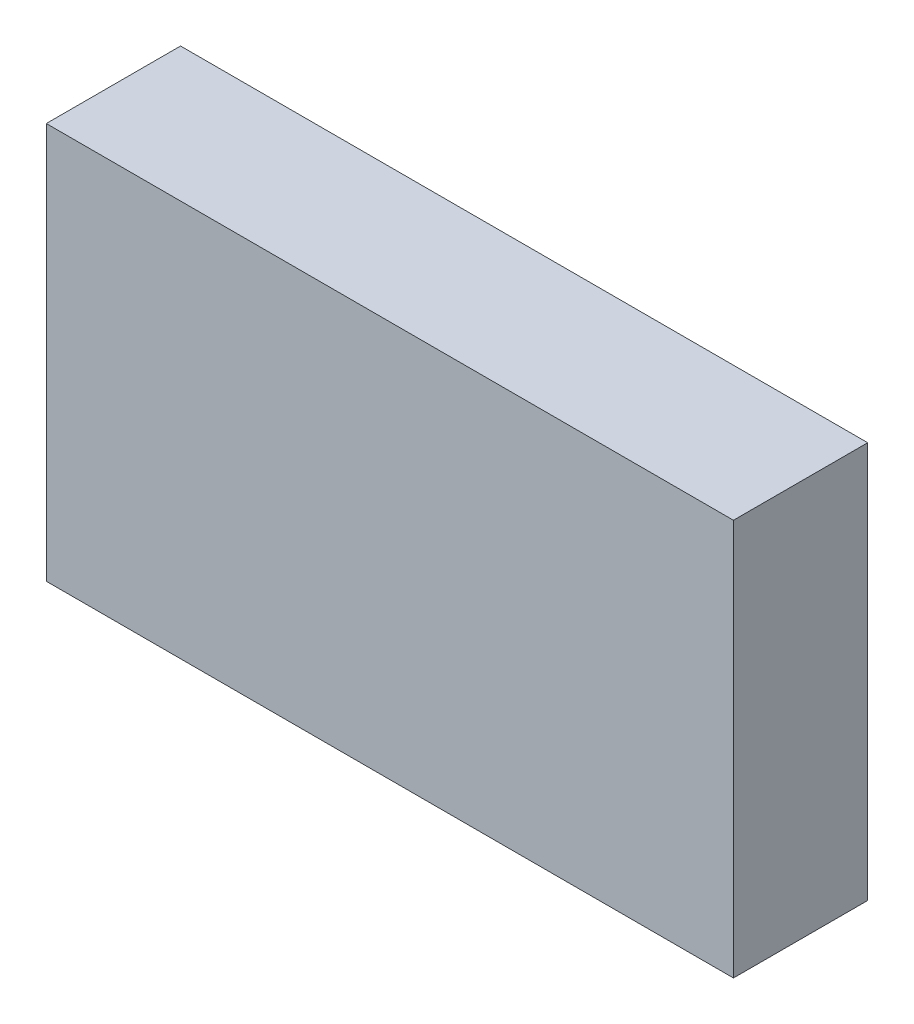
ISO-10303-21;
HEADER;
FILE_DESCRIPTION(('STEP AP214'),'2;1');
FILE_NAME('part.step','',(''),(''),'','','');
FILE_SCHEMA(('AUTOMOTIVE_DESIGN { 1 0 10303 214 1 1 1 1 }'));
ENDSEC;
DATA;
#1=APPLICATION_CONTEXT('core data for automotive mechanical design processes');
#2=APPLICATION_PROTOCOL_DEFINITION('international standard','automotive_design',2000,#1);
#3=PRODUCT_CONTEXT('',#1,'mechanical');
#4=PRODUCT('Part','Part','',(#3));
#5=PRODUCT_RELATED_PRODUCT_CATEGORY('part','',(#4));
#6=PRODUCT_DEFINITION_FORMATION('','',#4);
#7=PRODUCT_DEFINITION_CONTEXT('part definition',#1,'design');
#8=PRODUCT_DEFINITION('design','',#6,#7);
#9=PRODUCT_DEFINITION_SHAPE('','',#8);
#10=(LENGTH_UNIT() NAMED_UNIT(*) SI_UNIT(.MILLI.,.METRE.));
#11=(NAMED_UNIT(*) PLANE_ANGLE_UNIT() SI_UNIT($,.RADIAN.));
#12=(NAMED_UNIT(*) SI_UNIT($,.STERADIAN.) SOLID_ANGLE_UNIT());
#13=UNCERTAINTY_MEASURE_WITH_UNIT(LENGTH_MEASURE(1.E-05),#10,'distance_accuracy_value','');
#14=(GEOMETRIC_REPRESENTATION_CONTEXT(3) GLOBAL_UNCERTAINTY_ASSIGNED_CONTEXT((#13)) GLOBAL_UNIT_ASSIGNED_CONTEXT((#10,
#11,#12)) REPRESENTATION_CONTEXT('',''));
#15=CARTESIAN_POINT('',(0.,0.,0.));
#16=DIRECTION('',(0.,0.,1.));
#17=DIRECTION('',(1.,0.,0.));
#18=AXIS2_PLACEMENT_3D('',#15,#16,#17);
#19=CARTESIAN_POINT('',(-65.,0.,25.4));
#20=DIRECTION('',(1.,0.,0.));
#21=DIRECTION('',(0.,1.,0.));
#22=AXIS2_PLACEMENT_3D('',#19,#20,#21);
#23=PLANE('',#22);
#24=DIRECTION('',(0.,-1.,0.));
#25=VECTOR('',#24,1.);
#26=CARTESIAN_POINT('',(-65.,0.,0.));
#27=LINE('',#26,#25);
#28=CARTESIAN_POINT('',(-65.,0.,0.));
#29=VERTEX_POINT('',#28);
#30=CARTESIAN_POINT('',(-65.,-75.,0.));
#31=VERTEX_POINT('',#30);
#32=EDGE_CURVE('E97',#29,#31,#27,.T.);
#33=ORIENTED_EDGE('',*,*,#32,.T.);
#34=DIRECTION('',(0.,0.,-1.));
#35=VECTOR('',#34,1.);
#36=CARTESIAN_POINT('',(-65.,-75.,25.4));
#37=LINE('',#36,#35);
#38=CARTESIAN_POINT('',(-65.,-75.,25.4));
#39=VERTEX_POINT('',#38);
#40=EDGE_CURVE('E11',#39,#31,#37,.T.);
#41=ORIENTED_EDGE('',*,*,#40,.F.);
#42=DIRECTION('',(0.,-1.,0.));
#43=VECTOR('',#42,1.);
#44=CARTESIAN_POINT('',(-65.,0.,25.4));
#45=LINE('',#44,#43);
#46=CARTESIAN_POINT('',(-65.,0.,25.4));
#47=VERTEX_POINT('',#46);
#48=EDGE_CURVE('E85',#47,#39,#45,.T.);
#49=ORIENTED_EDGE('',*,*,#48,.F.);
#50=DIRECTION('',(0.,0.,-1.));
#51=VECTOR('',#50,1.);
#52=CARTESIAN_POINT('',(-65.,0.,25.4));
#53=LINE('',#52,#51);
#54=EDGE_CURVE('E93',#47,#29,#53,.T.);
#55=ORIENTED_EDGE('',*,*,#54,.T.);
#56=EDGE_LOOP('',(#33,#41,#49,#55));
#57=FACE_BOUND('',#56,.T.);
#58=ADVANCED_FACE('F34',(#57),#23,.F.);
#59=CARTESIAN_POINT('',(-65.,-75.,25.4));
#60=DIRECTION('',(0.,1.,0.));
#61=DIRECTION('',(0.,0.,1.));
#62=AXIS2_PLACEMENT_3D('',#59,#60,#61);
#63=PLANE('',#62);
#64=DIRECTION('',(1.,0.,0.));
#65=VECTOR('',#64,1.);
#66=CARTESIAN_POINT('',(-65.,-75.,0.));
#67=LINE('',#66,#65);
#68=CARTESIAN_POINT('',(65.,-75.,0.));
#69=VERTEX_POINT('',#68);
#70=EDGE_CURVE('E89',#31,#69,#67,.T.);
#71=ORIENTED_EDGE('',*,*,#70,.T.);
#72=DIRECTION('',(0.,0.,-1.));
#73=VECTOR('',#72,1.);
#74=CARTESIAN_POINT('',(65.,-75.,25.4));
#75=LINE('',#74,#73);
#76=CARTESIAN_POINT('',(65.,-75.,25.4));
#77=VERTEX_POINT('',#76);
#78=EDGE_CURVE('E42',#77,#69,#75,.T.);
#79=ORIENTED_EDGE('',*,*,#78,.F.);
#80=DIRECTION('',(1.,0.,0.));
#81=VECTOR('',#80,1.);
#82=CARTESIAN_POINT('',(-65.,-75.,25.4));
#83=LINE('',#82,#81);
#84=EDGE_CURVE('E80',#39,#77,#83,.T.);
#85=ORIENTED_EDGE('',*,*,#84,.F.);
#86=ORIENTED_EDGE('',*,*,#40,.T.);
#87=EDGE_LOOP('',(#71,#79,#85,#86));
#88=FACE_BOUND('',#87,.T.);
#89=ADVANCED_FACE('F88',(#88),#63,.F.);
#90=CARTESIAN_POINT('',(65.,0.,25.4));
#91=DIRECTION('',(-1.,0.,0.));
#92=DIRECTION('',(0.,-1.,0.));
#93=AXIS2_PLACEMENT_3D('',#90,#91,#92);
#94=PLANE('',#93);
#95=DIRECTION('',(0.,1.,0.));
#96=VECTOR('',#95,1.);
#97=CARTESIAN_POINT('',(65.,0.,0.));
#98=LINE('',#97,#96);
#99=CARTESIAN_POINT('',(65.,0.,0.));
#100=VERTEX_POINT('',#99);
#101=EDGE_CURVE('E67',#69,#100,#98,.T.);
#102=ORIENTED_EDGE('',*,*,#101,.T.);
#103=DIRECTION('',(0.,0.,-1.));
#104=VECTOR('',#103,1.);
#105=CARTESIAN_POINT('',(65.,0.,25.4));
#106=LINE('',#105,#104);
#107=CARTESIAN_POINT('',(65.,0.,25.4));
#108=VERTEX_POINT('',#107);
#109=EDGE_CURVE('E90',#108,#100,#106,.T.);
#110=ORIENTED_EDGE('',*,*,#109,.F.);
#111=DIRECTION('',(0.,1.,0.));
#112=VECTOR('',#111,1.);
#113=CARTESIAN_POINT('',(65.,0.,25.4));
#114=LINE('',#113,#112);
#115=EDGE_CURVE('E83',#77,#108,#114,.T.);
#116=ORIENTED_EDGE('',*,*,#115,.F.);
#117=ORIENTED_EDGE('',*,*,#78,.T.);
#118=EDGE_LOOP('',(#102,#110,#116,#117));
#119=FACE_BOUND('',#118,.T.);
#120=ADVANCED_FACE('F91',(#119),#94,.F.);
#121=CARTESIAN_POINT('',(-65.,0.,25.4));
#122=DIRECTION('',(0.,-1.,0.));
#123=DIRECTION('',(0.,0.,-1.));
#124=AXIS2_PLACEMENT_3D('',#121,#122,#123);
#125=PLANE('',#124);
#126=DIRECTION('',(-1.,0.,0.));
#127=VECTOR('',#126,1.);
#128=CARTESIAN_POINT('',(-65.,0.,0.));
#129=LINE('',#128,#127);
#130=EDGE_CURVE('E73',#100,#29,#129,.T.);
#131=ORIENTED_EDGE('',*,*,#130,.T.);
#132=ORIENTED_EDGE('',*,*,#54,.F.);
#133=DIRECTION('',(-1.,0.,0.));
#134=VECTOR('',#133,1.);
#135=CARTESIAN_POINT('',(-65.,0.,25.4));
#136=LINE('',#135,#134);
#137=EDGE_CURVE('E50',#108,#47,#136,.T.);
#138=ORIENTED_EDGE('',*,*,#137,.F.);
#139=ORIENTED_EDGE('',*,*,#109,.T.);
#140=EDGE_LOOP('',(#131,#132,#138,#139));
#141=FACE_BOUND('',#140,.T.);
#142=ADVANCED_FACE('F104',(#141),#125,.F.);
#143=CARTESIAN_POINT('',(0.,0.,25.4));
#144=DIRECTION('',(0.,0.,1.));
#145=DIRECTION('',(1.,0.,0.));
#146=AXIS2_PLACEMENT_3D('',#143,#144,#145);
#147=PLANE('',#146);
#148=ORIENTED_EDGE('',*,*,#48,.T.);
#149=ORIENTED_EDGE('',*,*,#84,.T.);
#150=ORIENTED_EDGE('',*,*,#115,.T.);
#151=ORIENTED_EDGE('',*,*,#137,.T.);
#152=EDGE_LOOP('',(#148,#149,#150,#151));
#153=FACE_BOUND('',#152,.T.);
#154=ADVANCED_FACE('F81',(#153),#147,.T.);
#155=CARTESIAN_POINT('',(0.,0.,0.));
#156=DIRECTION('',(0.,0.,1.));
#157=DIRECTION('',(1.,0.,0.));
#158=AXIS2_PLACEMENT_3D('',#155,#156,#157);
#159=PLANE('',#158);
#160=ORIENTED_EDGE('',*,*,#32,.F.);
#161=ORIENTED_EDGE('',*,*,#130,.F.);
#162=ORIENTED_EDGE('',*,*,#101,.F.);
#163=ORIENTED_EDGE('',*,*,#70,.F.);
#164=EDGE_LOOP('',(#160,#161,#162,#163));
#165=FACE_BOUND('',#164,.T.);
#166=ADVANCED_FACE('F107',(#165),#159,.F.);
#167=CLOSED_SHELL('',(#58,#89,#120,#142,#154,#166));
#168=MANIFOLD_SOLID_BREP('B2',#167);
#169=ADVANCED_BREP_SHAPE_REPRESENTATION('',(#18,#168),#14);
#170=SHAPE_DEFINITION_REPRESENTATION(#9,#169);
ENDSEC;
END-ISO-10303-21;
